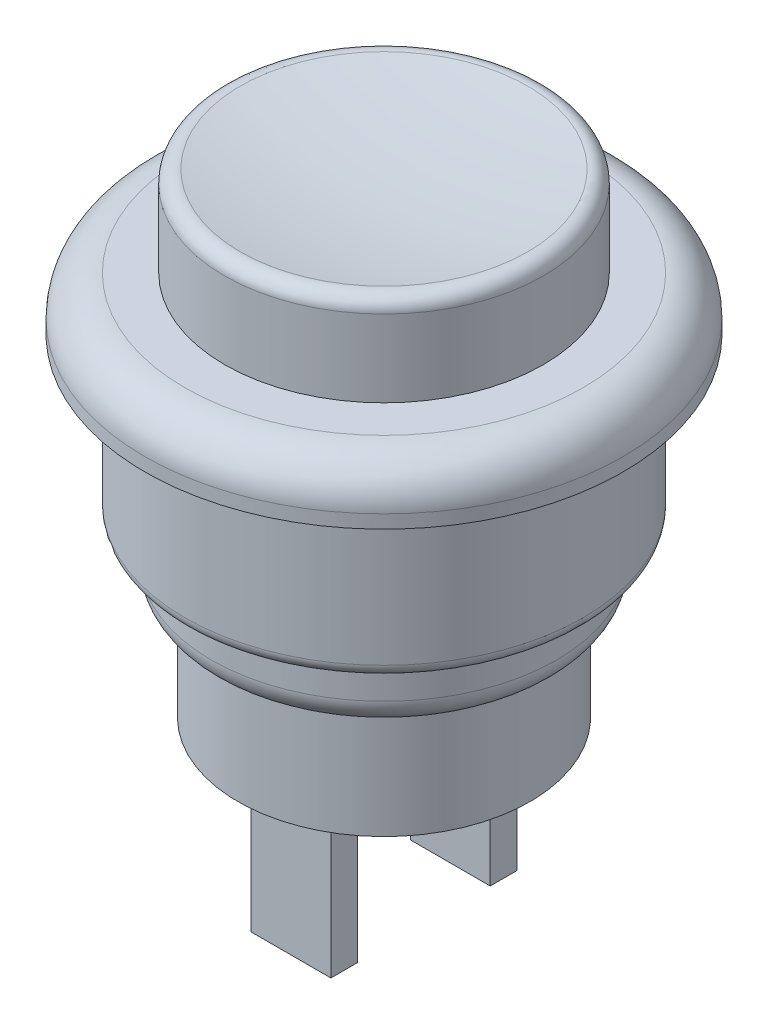
ISO-10303-21;
HEADER;
FILE_DESCRIPTION(('STEP AP214'),'2;1');
FILE_NAME('part.step','',(''),(''),'','','');
FILE_SCHEMA(('AUTOMOTIVE_DESIGN { 1 0 10303 214 1 1 1 1 }'));
ENDSEC;
DATA;
#1=APPLICATION_CONTEXT('core data for automotive mechanical design processes');
#2=APPLICATION_PROTOCOL_DEFINITION('international standard','automotive_design',2000,#1);
#3=PRODUCT_CONTEXT('',#1,'mechanical');
#4=PRODUCT('Part','Part','',(#3));
#5=PRODUCT_RELATED_PRODUCT_CATEGORY('part','',(#4));
#6=PRODUCT_DEFINITION_FORMATION('','',#4);
#7=PRODUCT_DEFINITION_CONTEXT('part definition',#1,'design');
#8=PRODUCT_DEFINITION('design','',#6,#7);
#9=PRODUCT_DEFINITION_SHAPE('','',#8);
#10=(LENGTH_UNIT() NAMED_UNIT(*) SI_UNIT(.MILLI.,.METRE.));
#11=(NAMED_UNIT(*) PLANE_ANGLE_UNIT() SI_UNIT($,.RADIAN.));
#12=(NAMED_UNIT(*) SI_UNIT($,.STERADIAN.) SOLID_ANGLE_UNIT());
#13=UNCERTAINTY_MEASURE_WITH_UNIT(LENGTH_MEASURE(1.E-05),#10,'distance_accuracy_value','');
#14=(GEOMETRIC_REPRESENTATION_CONTEXT(3) GLOBAL_UNCERTAINTY_ASSIGNED_CONTEXT((#13)) GLOBAL_UNIT_ASSIGNED_CONTEXT((#10,
#11,#12)) REPRESENTATION_CONTEXT('',''));
#15=CARTESIAN_POINT('',(0.,0.,0.));
#16=DIRECTION('',(0.,0.,1.));
#17=DIRECTION('',(1.,0.,0.));
#18=AXIS2_PLACEMENT_3D('',#15,#16,#17);
#19=CARTESIAN_POINT('',(5.5,-9.,0.));
#20=DIRECTION('',(0.,-1.,0.));
#21=DIRECTION('',(0.,0.,-1.));
#22=AXIS2_PLACEMENT_3D('',#19,#20,#21);
#23=PLANE('',#22);
#24=CARTESIAN_POINT('',(0.,-9.,0.));
#25=DIRECTION('',(0.,-1.,0.));
#26=DIRECTION('',(0.,0.,-1.));
#27=AXIS2_PLACEMENT_3D('',#24,#25,#26);
#28=CIRCLE('',#27,5.5);
#29=CARTESIAN_POINT('',(0.,-9.,-5.5));
#30=VERTEX_POINT('',#29);
#31=EDGE_CURVE('E171',#30,#30,#28,.T.);
#32=ORIENTED_EDGE('',*,*,#31,.T.);
#33=EDGE_LOOP('',(#32));
#34=FACE_BOUND('',#33,.T.);
#35=DIRECTION('',(1.,0.,0.));
#36=VECTOR('',#35,1.);
#37=CARTESIAN_POINT('',(-1.5,-9.,2.5));
#38=LINE('',#37,#36);
#39=CARTESIAN_POINT('',(-1.5,-9.,2.5));
#40=VERTEX_POINT('',#39);
#41=CARTESIAN_POINT('',(1.5,-9.,2.5));
#42=VERTEX_POINT('',#41);
#43=EDGE_CURVE('E128',#40,#42,#38,.T.);
#44=ORIENTED_EDGE('',*,*,#43,.F.);
#45=DIRECTION('',(0.,0.,-1.));
#46=VECTOR('',#45,1.);
#47=CARTESIAN_POINT('',(-1.5,-9.,3.5));
#48=LINE('',#47,#46);
#49=CARTESIAN_POINT('',(-1.5,-9.,3.5));
#50=VERTEX_POINT('',#49);
#51=EDGE_CURVE('E125',#50,#40,#48,.T.);
#52=ORIENTED_EDGE('',*,*,#51,.F.);
#53=DIRECTION('',(-1.,0.,0.));
#54=VECTOR('',#53,1.);
#55=CARTESIAN_POINT('',(-1.5,-9.,3.5));
#56=LINE('',#55,#54);
#57=CARTESIAN_POINT('',(1.5,-9.,3.5));
#58=VERTEX_POINT('',#57);
#59=EDGE_CURVE('E137',#58,#50,#56,.T.);
#60=ORIENTED_EDGE('',*,*,#59,.F.);
#61=DIRECTION('',(0.,0.,1.));
#62=VECTOR('',#61,1.);
#63=CARTESIAN_POINT('',(1.5,-9.,3.5));
#64=LINE('',#63,#62);
#65=EDGE_CURVE('E145',#42,#58,#64,.T.);
#66=ORIENTED_EDGE('',*,*,#65,.F.);
#67=EDGE_LOOP('',(#44,#52,#60,#66));
#68=FACE_BOUND('',#67,.T.);
#69=DIRECTION('',(1.,0.,0.));
#70=VECTOR('',#69,1.);
#71=CARTESIAN_POINT('',(-1.5,-9.,-3.5));
#72=LINE('',#71,#70);
#73=CARTESIAN_POINT('',(-1.5,-9.,-3.5));
#74=VERTEX_POINT('',#73);
#75=CARTESIAN_POINT('',(1.5,-9.,-3.5));
#76=VERTEX_POINT('',#75);
#77=EDGE_CURVE('E494',#74,#76,#72,.T.);
#78=ORIENTED_EDGE('',*,*,#77,.F.);
#79=DIRECTION('',(0.,0.,-1.));
#80=VECTOR('',#79,1.);
#81=CARTESIAN_POINT('',(-1.5,-9.,-3.5));
#82=LINE('',#81,#80);
#83=CARTESIAN_POINT('',(-1.5,-9.,-2.5));
#84=VERTEX_POINT('',#83);
#85=EDGE_CURVE('E123',#84,#74,#82,.T.);
#86=ORIENTED_EDGE('',*,*,#85,.F.);
#87=DIRECTION('',(-1.,0.,0.));
#88=VECTOR('',#87,1.);
#89=CARTESIAN_POINT('',(-1.5,-9.,-2.5));
#90=LINE('',#89,#88);
#91=CARTESIAN_POINT('',(1.5,-9.,-2.5));
#92=VERTEX_POINT('',#91);
#93=EDGE_CURVE('E119',#92,#84,#90,.T.);
#94=ORIENTED_EDGE('',*,*,#93,.F.);
#95=DIRECTION('',(0.,0.,1.));
#96=VECTOR('',#95,1.);
#97=CARTESIAN_POINT('',(1.5,-9.,-3.5));
#98=LINE('',#97,#96);
#99=EDGE_CURVE('E491',#76,#92,#98,.T.);
#100=ORIENTED_EDGE('',*,*,#99,.F.);
#101=EDGE_LOOP('',(#78,#86,#94,#100));
#102=FACE_BOUND('',#101,.T.);
#103=ADVANCED_FACE('F34',(#34,#68,#102),#23,.T.);
#104=CARTESIAN_POINT('',(0.,-9.,0.));
#105=DIRECTION('',(0.,-1.,0.));
#106=DIRECTION('',(0.,0.,-1.));
#107=AXIS2_PLACEMENT_3D('',#104,#105,#106);
#108=CYLINDRICAL_SURFACE('',#107,5.5);
#109=CARTESIAN_POINT('',(0.,-5.,0.));
#110=DIRECTION('',(0.,-1.,0.));
#111=DIRECTION('',(0.,0.,-1.));
#112=AXIS2_PLACEMENT_3D('',#109,#110,#111);
#113=CIRCLE('',#112,5.5);
#114=CARTESIAN_POINT('',(0.,-5.,-5.5));
#115=VERTEX_POINT('',#114);
#116=EDGE_CURVE('E168',#115,#115,#113,.T.);
#117=ORIENTED_EDGE('',*,*,#116,.T.);
#118=EDGE_LOOP('',(#117));
#119=FACE_BOUND('',#118,.T.);
#120=ORIENTED_EDGE('',*,*,#31,.F.);
#121=EDGE_LOOP('',(#120));
#122=FACE_BOUND('',#121,.T.);
#123=ADVANCED_FACE('F212',(#119,#122),#108,.T.);
#124=CARTESIAN_POINT('',(0.,-5.,0.));
#125=DIRECTION('',(0.,1.,0.));
#126=DIRECTION('',(0.,0.,1.));
#127=AXIS2_PLACEMENT_3D('',#124,#125,#126);
#128=CONICAL_SURFACE('',#127,5.5,1.10714871779409);
#129=CARTESIAN_POINT('',(0.,-4.77639320225002,0.));
#130=DIRECTION('',(0.,-1.,0.));
#131=DIRECTION('',(0.,0.,-1.));
#132=AXIS2_PLACEMENT_3D('',#129,#130,#131);
#133=CIRCLE('',#132,5.94721359549995);
#134=CARTESIAN_POINT('',(0.,-4.77639320225002,-5.94721359549995));
#135=VERTEX_POINT('',#134);
#136=EDGE_CURVE('E186',#135,#135,#133,.T.);
#137=ORIENTED_EDGE('',*,*,#136,.T.);
#138=EDGE_LOOP('',(#137));
#139=FACE_BOUND('',#138,.T.);
#140=ORIENTED_EDGE('',*,*,#116,.F.);
#141=EDGE_LOOP('',(#140));
#142=FACE_BOUND('',#141,.T.);
#143=ADVANCED_FACE('F218',(#139,#142),#128,.T.);
#144=CARTESIAN_POINT('',(0.,-9.,0.));
#145=DIRECTION('',(0.,-1.,0.));
#146=DIRECTION('',(0.,0.,-1.));
#147=AXIS2_PLACEMENT_3D('',#144,#145,#146);
#148=CYLINDRICAL_SURFACE('',#147,6.5);
#149=CARTESIAN_POINT('',(0.,-3.8819660112501,0.));
#150=DIRECTION('',(0.,1.,0.));
#151=DIRECTION('',(0.,0.,1.));
#152=AXIS2_PLACEMENT_3D('',#149,#150,#151);
#153=CIRCLE('',#152,6.5);
#154=CARTESIAN_POINT('',(0.,-3.8819660112501,6.5));
#155=VERTEX_POINT('',#154);
#156=EDGE_CURVE('E189',#155,#155,#153,.T.);
#157=ORIENTED_EDGE('',*,*,#156,.T.);
#158=EDGE_LOOP('',(#157));
#159=FACE_BOUND('',#158,.T.);
#160=CARTESIAN_POINT('',(0.,-2.5,0.));
#161=DIRECTION('',(0.,-1.,0.));
#162=DIRECTION('',(0.,0.,-1.));
#163=AXIS2_PLACEMENT_3D('',#160,#161,#162);
#164=CIRCLE('',#163,6.5);
#165=CARTESIAN_POINT('',(0.,-2.5,-6.5));
#166=VERTEX_POINT('',#165);
#167=EDGE_CURVE('E165',#166,#166,#164,.T.);
#168=ORIENTED_EDGE('',*,*,#167,.T.);
#169=EDGE_LOOP('',(#168));
#170=FACE_BOUND('',#169,.T.);
#171=ADVANCED_FACE('F265',(#159,#170),#148,.T.);
#172=CARTESIAN_POINT('',(7.5,-2.5,0.));
#173=DIRECTION('',(0.,-1.,0.));
#174=DIRECTION('',(0.,0.,-1.));
#175=AXIS2_PLACEMENT_3D('',#172,#173,#174);
#176=PLANE('',#175);
#177=CARTESIAN_POINT('',(0.,-2.5,0.));
#178=DIRECTION('',(0.,-1.,0.));
#179=DIRECTION('',(0.,0.,-1.));
#180=AXIS2_PLACEMENT_3D('',#177,#178,#179);
#181=CIRCLE('',#180,7.);
#182=CARTESIAN_POINT('',(0.,-2.5,-7.));
#183=VERTEX_POINT('',#182);
#184=EDGE_CURVE('E42',#183,#183,#181,.T.);
#185=ORIENTED_EDGE('',*,*,#184,.T.);
#186=EDGE_LOOP('',(#185));
#187=FACE_BOUND('',#186,.T.);
#188=ORIENTED_EDGE('',*,*,#167,.F.);
#189=EDGE_LOOP('',(#188));
#190=FACE_BOUND('',#189,.T.);
#191=ADVANCED_FACE('F194',(#187,#190),#176,.T.);
#192=CARTESIAN_POINT('',(0.,-9.,0.));
#193=DIRECTION('',(0.,-1.,0.));
#194=DIRECTION('',(0.,0.,-1.));
#195=AXIS2_PLACEMENT_3D('',#192,#193,#194);
#196=CYLINDRICAL_SURFACE('',#195,7.5);
#197=CARTESIAN_POINT('',(0.,-2.,0.));
#198=DIRECTION('',(0.,-1.,0.));
#199=DIRECTION('',(0.,0.,-1.));
#200=AXIS2_PLACEMENT_3D('',#197,#198,#199);
#201=CIRCLE('',#200,7.5);
#202=CARTESIAN_POINT('',(0.,-2.,-7.5));
#203=VERTEX_POINT('',#202);
#204=EDGE_CURVE('E11',#203,#203,#201,.F.);
#205=ORIENTED_EDGE('',*,*,#204,.T.);
#206=EDGE_LOOP('',(#205));
#207=FACE_BOUND('',#206,.T.);
#208=CARTESIAN_POINT('',(0.,3.5,0.));
#209=DIRECTION('',(0.,-1.,0.));
#210=DIRECTION('',(0.,0.,-1.));
#211=AXIS2_PLACEMENT_3D('',#208,#209,#210);
#212=CIRCLE('',#211,7.5);
#213=CARTESIAN_POINT('',(0.,3.5,-7.5));
#214=VERTEX_POINT('',#213);
#215=EDGE_CURVE('E162',#214,#214,#212,.T.);
#216=ORIENTED_EDGE('',*,*,#215,.T.);
#217=EDGE_LOOP('',(#216));
#218=FACE_BOUND('',#217,.T.);
#219=ADVANCED_FACE('F258',(#207,#218),#196,.T.);
#220=CARTESIAN_POINT('',(9.,3.5,0.));
#221=DIRECTION('',(0.,-1.,0.));
#222=DIRECTION('',(0.,0.,-1.));
#223=AXIS2_PLACEMENT_3D('',#220,#221,#222);
#224=PLANE('',#223);
#225=CARTESIAN_POINT('',(0.,3.5,0.));
#226=DIRECTION('',(0.,-1.,0.));
#227=DIRECTION('',(0.,0.,-1.));
#228=AXIS2_PLACEMENT_3D('',#225,#226,#227);
#229=CIRCLE('',#228,9.);
#230=CARTESIAN_POINT('',(0.,3.5,-9.));
#231=VERTEX_POINT('',#230);
#232=EDGE_CURVE('E159',#231,#231,#229,.T.);
#233=ORIENTED_EDGE('',*,*,#232,.T.);
#234=EDGE_LOOP('',(#233));
#235=FACE_BOUND('',#234,.T.);
#236=ORIENTED_EDGE('',*,*,#215,.F.);
#237=EDGE_LOOP('',(#236));
#238=FACE_BOUND('',#237,.T.);
#239=ADVANCED_FACE('F251',(#235,#238),#224,.T.);
#240=CARTESIAN_POINT('',(0.,-9.,0.));
#241=DIRECTION('',(0.,-1.,0.));
#242=DIRECTION('',(0.,0.,-1.));
#243=AXIS2_PLACEMENT_3D('',#240,#241,#242);
#244=CYLINDRICAL_SURFACE('',#243,9.);
#245=CARTESIAN_POINT('',(0.,4.,0.));
#246=DIRECTION('',(0.,1.,0.));
#247=DIRECTION('',(0.,0.,1.));
#248=AXIS2_PLACEMENT_3D('',#245,#246,#247);
#249=CIRCLE('',#248,9.);
#250=CARTESIAN_POINT('',(0.,4.,9.));
#251=VERTEX_POINT('',#250);
#252=EDGE_CURVE('E174',#251,#251,#249,.F.);
#253=ORIENTED_EDGE('',*,*,#252,.T.);
#254=EDGE_LOOP('',(#253));
#255=FACE_BOUND('',#254,.T.);
#256=ORIENTED_EDGE('',*,*,#232,.F.);
#257=EDGE_LOOP('',(#256));
#258=FACE_BOUND('',#257,.T.);
#259=ADVANCED_FACE('F245',(#255,#258),#244,.T.);
#260=CARTESIAN_POINT('',(6.,5.5,0.));
#261=DIRECTION('',(0.,1.,0.));
#262=DIRECTION('',(0.,0.,1.));
#263=AXIS2_PLACEMENT_3D('',#260,#261,#262);
#264=PLANE('',#263);
#265=CARTESIAN_POINT('',(0.,5.5,0.));
#266=DIRECTION('',(0.,1.,0.));
#267=DIRECTION('',(0.,0.,1.));
#268=AXIS2_PLACEMENT_3D('',#265,#266,#267);
#269=CIRCLE('',#268,7.5);
#270=CARTESIAN_POINT('',(0.,5.5,7.5));
#271=VERTEX_POINT('',#270);
#272=EDGE_CURVE('E177',#271,#271,#269,.T.);
#273=ORIENTED_EDGE('',*,*,#272,.T.);
#274=EDGE_LOOP('',(#273));
#275=FACE_BOUND('',#274,.T.);
#276=CARTESIAN_POINT('',(0.,5.5,0.));
#277=DIRECTION('',(0.,-1.,0.));
#278=DIRECTION('',(0.,0.,-1.));
#279=AXIS2_PLACEMENT_3D('',#276,#277,#278);
#280=CIRCLE('',#279,6.);
#281=CARTESIAN_POINT('',(0.,5.5,-6.));
#282=VERTEX_POINT('',#281);
#283=EDGE_CURVE('E156',#282,#282,#280,.T.);
#284=ORIENTED_EDGE('',*,*,#283,.T.);
#285=EDGE_LOOP('',(#284));
#286=FACE_BOUND('',#285,.T.);
#287=ADVANCED_FACE('F240',(#275,#286),#264,.T.);
#288=CARTESIAN_POINT('',(0.,-9.,0.));
#289=DIRECTION('',(0.,-1.,0.));
#290=DIRECTION('',(0.,0.,-1.));
#291=AXIS2_PLACEMENT_3D('',#288,#289,#290);
#292=CYLINDRICAL_SURFACE('',#291,6.);
#293=CARTESIAN_POINT('',(0.,8.39430237914633,0.));
#294=DIRECTION('',(0.,1.,0.));
#295=DIRECTION('',(0.,0.,1.));
#296=AXIS2_PLACEMENT_3D('',#293,#294,#295);
#297=CIRCLE('',#296,6.);
#298=CARTESIAN_POINT('',(0.,8.39430237914633,6.));
#299=VERTEX_POINT('',#298);
#300=EDGE_CURVE('E180',#299,#299,#297,.F.);
#301=ORIENTED_EDGE('',*,*,#300,.T.);
#302=EDGE_LOOP('',(#301));
#303=FACE_BOUND('',#302,.T.);
#304=ORIENTED_EDGE('',*,*,#283,.F.);
#305=EDGE_LOOP('',(#304));
#306=FACE_BOUND('',#305,.T.);
#307=ADVANCED_FACE('F237',(#303,#306),#292,.T.);
#308=CARTESIAN_POINT('',(0.,38.5041355995166,0.));
#309=DIRECTION('',(0.,-1.,0.));
#310=DIRECTION('',(1.,0.,0.));
#311=AXIS2_PLACEMENT_3D('',#308,#309,#310);
#312=SPHERICAL_SURFACE('',#311,30.1080390838504);
#313=CARTESIAN_POINT('',(0.,8.88616389856423,0.));
#314=DIRECTION('',(0.,1.,0.));
#315=DIRECTION('',(0.,0.,1.));
#316=AXIS2_PLACEMENT_3D('',#313,#314,#315);
#317=CIRCLE('',#316,5.41015432277558);
#318=CARTESIAN_POINT('',(0.,8.88616389856423,5.41015432277558));
#319=VERTEX_POINT('',#318);
#320=EDGE_CURVE('E183',#319,#319,#317,.T.);
#321=ORIENTED_EDGE('',*,*,#320,.T.);
#322=EDGE_LOOP('',(#321));
#323=FACE_BOUND('',#322,.T.);
#324=ADVANCED_FACE('F227',(#323),#312,.F.);
#325=CARTESIAN_POINT('',(0.,4.,0.));
#326=DIRECTION('',(0.,1.,0.));
#327=DIRECTION('',(0.,0.,1.));
#328=AXIS2_PLACEMENT_3D('',#325,#326,#327);
#329=TOROIDAL_SURFACE('',#328,7.5,1.5);
#330=ORIENTED_EDGE('',*,*,#272,.F.);
#331=EDGE_LOOP('',(#330));
#332=FACE_BOUND('',#331,.T.);
#333=ORIENTED_EDGE('',*,*,#252,.F.);
#334=EDGE_LOOP('',(#333));
#335=FACE_BOUND('',#334,.T.);
#336=ADVANCED_FACE('F224',(#332,#335),#329,.T.);
#337=CARTESIAN_POINT('',(0.,8.39430237914633,0.));
#338=DIRECTION('',(0.,1.,0.));
#339=DIRECTION('',(0.,0.,1.));
#340=AXIS2_PLACEMENT_3D('',#337,#338,#339);
#341=TOROIDAL_SURFACE('',#340,5.5,0.5);
#342=ORIENTED_EDGE('',*,*,#320,.F.);
#343=EDGE_LOOP('',(#342));
#344=FACE_BOUND('',#343,.T.);
#345=ORIENTED_EDGE('',*,*,#300,.F.);
#346=EDGE_LOOP('',(#345));
#347=FACE_BOUND('',#346,.T.);
#348=ADVANCED_FACE('F208',(#344,#347),#341,.T.);
#349=CARTESIAN_POINT('',(0.,-3.8819660112501,0.));
#350=DIRECTION('',(0.,1.,0.));
#351=DIRECTION('',(0.,0.,1.));
#352=AXIS2_PLACEMENT_3D('',#349,#350,#351);
#353=TOROIDAL_SURFACE('',#352,5.5,1.);
#354=ORIENTED_EDGE('',*,*,#156,.F.);
#355=EDGE_LOOP('',(#354));
#356=FACE_BOUND('',#355,.T.);
#357=ORIENTED_EDGE('',*,*,#136,.F.);
#358=EDGE_LOOP('',(#357));
#359=FACE_BOUND('',#358,.T.);
#360=ADVANCED_FACE('F199',(#356,#359),#353,.T.);
#361=CARTESIAN_POINT('',(0.,-2.,0.));
#362=DIRECTION('',(0.,-1.,0.));
#363=DIRECTION('',(0.,0.,-1.));
#364=AXIS2_PLACEMENT_3D('',#361,#362,#363);
#365=TOROIDAL_SURFACE('',#364,7.,0.5);
#366=ORIENTED_EDGE('',*,*,#204,.F.);
#367=EDGE_LOOP('',(#366));
#368=FACE_BOUND('',#367,.T.);
#369=ORIENTED_EDGE('',*,*,#184,.F.);
#370=EDGE_LOOP('',(#369));
#371=FACE_BOUND('',#370,.T.);
#372=ADVANCED_FACE('F36',(#368,#371),#365,.T.);
#373=CARTESIAN_POINT('',(-1.5,-15.,3.5));
#374=DIRECTION('',(1.,0.,0.));
#375=DIRECTION('',(0.,0.,-1.));
#376=AXIS2_PLACEMENT_3D('',#373,#374,#375);
#377=PLANE('',#376);
#378=ORIENTED_EDGE('',*,*,#51,.T.);
#379=DIRECTION('',(0.,1.,0.));
#380=VECTOR('',#379,1.);
#381=CARTESIAN_POINT('',(-1.5,-15.,2.5));
#382=LINE('',#381,#380);
#383=CARTESIAN_POINT('',(-1.5,-15.,2.5));
#384=VERTEX_POINT('',#383);
#385=EDGE_CURVE('E154',#384,#40,#382,.T.);
#386=ORIENTED_EDGE('',*,*,#385,.F.);
#387=DIRECTION('',(0.,0.,-1.));
#388=VECTOR('',#387,1.);
#389=CARTESIAN_POINT('',(-1.5,-15.,3.5));
#390=LINE('',#389,#388);
#391=CARTESIAN_POINT('',(-1.5,-15.,3.5));
#392=VERTEX_POINT('',#391);
#393=EDGE_CURVE('E133',#392,#384,#390,.T.);
#394=ORIENTED_EDGE('',*,*,#393,.F.);
#395=DIRECTION('',(0.,1.,0.));
#396=VECTOR('',#395,1.);
#397=CARTESIAN_POINT('',(-1.5,-15.,3.5));
#398=LINE('',#397,#396);
#399=EDGE_CURVE('E142',#392,#50,#398,.T.);
#400=ORIENTED_EDGE('',*,*,#399,.T.);
#401=EDGE_LOOP('',(#378,#386,#394,#400));
#402=FACE_BOUND('',#401,.T.);
#403=ADVANCED_FACE('F198',(#402),#377,.F.);
#404=CARTESIAN_POINT('',(-1.5,-15.,2.5));
#405=DIRECTION('',(0.,0.,1.));
#406=DIRECTION('',(1.,0.,0.));
#407=AXIS2_PLACEMENT_3D('',#404,#405,#406);
#408=PLANE('',#407);
#409=ORIENTED_EDGE('',*,*,#43,.T.);
#410=DIRECTION('',(0.,1.,0.));
#411=VECTOR('',#410,1.);
#412=CARTESIAN_POINT('',(1.5,-15.,2.5));
#413=LINE('',#412,#411);
#414=CARTESIAN_POINT('',(1.5,-15.,2.5));
#415=VERTEX_POINT('',#414);
#416=EDGE_CURVE('E151',#415,#42,#413,.T.);
#417=ORIENTED_EDGE('',*,*,#416,.F.);
#418=DIRECTION('',(1.,0.,0.));
#419=VECTOR('',#418,1.);
#420=CARTESIAN_POINT('',(-1.5,-15.,2.5));
#421=LINE('',#420,#419);
#422=EDGE_CURVE('E136',#384,#415,#421,.T.);
#423=ORIENTED_EDGE('',*,*,#422,.F.);
#424=ORIENTED_EDGE('',*,*,#385,.T.);
#425=EDGE_LOOP('',(#409,#417,#423,#424));
#426=FACE_BOUND('',#425,.T.);
#427=ADVANCED_FACE('F205',(#426),#408,.F.);
#428=CARTESIAN_POINT('',(1.5,-15.,3.5));
#429=DIRECTION('',(-1.,0.,0.));
#430=DIRECTION('',(0.,0.,1.));
#431=AXIS2_PLACEMENT_3D('',#428,#429,#430);
#432=PLANE('',#431);
#433=ORIENTED_EDGE('',*,*,#65,.T.);
#434=DIRECTION('',(0.,1.,0.));
#435=VECTOR('',#434,1.);
#436=CARTESIAN_POINT('',(1.5,-15.,3.5));
#437=LINE('',#436,#435);
#438=CARTESIAN_POINT('',(1.5,-15.,3.5));
#439=VERTEX_POINT('',#438);
#440=EDGE_CURVE('E57',#439,#58,#437,.T.);
#441=ORIENTED_EDGE('',*,*,#440,.F.);
#442=DIRECTION('',(0.,0.,1.));
#443=VECTOR('',#442,1.);
#444=CARTESIAN_POINT('',(1.5,-15.,3.5));
#445=LINE('',#444,#443);
#446=EDGE_CURVE('E139',#415,#439,#445,.T.);
#447=ORIENTED_EDGE('',*,*,#446,.F.);
#448=ORIENTED_EDGE('',*,*,#416,.T.);
#449=EDGE_LOOP('',(#433,#441,#447,#448));
#450=FACE_BOUND('',#449,.T.);
#451=ADVANCED_FACE('F394',(#450),#432,.F.);
#452=CARTESIAN_POINT('',(-1.5,-15.,3.5));
#453=DIRECTION('',(0.,0.,-1.));
#454=DIRECTION('',(-1.,0.,0.));
#455=AXIS2_PLACEMENT_3D('',#452,#453,#454);
#456=PLANE('',#455);
#457=ORIENTED_EDGE('',*,*,#59,.T.);
#458=ORIENTED_EDGE('',*,*,#399,.F.);
#459=DIRECTION('',(-1.,0.,0.));
#460=VECTOR('',#459,1.);
#461=CARTESIAN_POINT('',(-1.5,-15.,3.5));
#462=LINE('',#461,#460);
#463=EDGE_CURVE('E141',#439,#392,#462,.T.);
#464=ORIENTED_EDGE('',*,*,#463,.F.);
#465=ORIENTED_EDGE('',*,*,#440,.T.);
#466=EDGE_LOOP('',(#457,#458,#464,#465));
#467=FACE_BOUND('',#466,.T.);
#468=ADVANCED_FACE('F405',(#467),#456,.F.);
#469=CARTESIAN_POINT('',(0.,-15.,0.));
#470=DIRECTION('',(0.,-1.,0.));
#471=DIRECTION('',(0.,0.,-1.));
#472=AXIS2_PLACEMENT_3D('',#469,#470,#471);
#473=PLANE('',#472);
#474=ORIENTED_EDGE('',*,*,#393,.T.);
#475=ORIENTED_EDGE('',*,*,#422,.T.);
#476=ORIENTED_EDGE('',*,*,#446,.T.);
#477=ORIENTED_EDGE('',*,*,#463,.T.);
#478=EDGE_LOOP('',(#474,#475,#476,#477));
#479=FACE_BOUND('',#478,.T.);
#480=ADVANCED_FACE('F416',(#479),#473,.T.);
#481=CARTESIAN_POINT('',(-1.5,-15.,-3.5));
#482=DIRECTION('',(1.,0.,0.));
#483=DIRECTION('',(0.,0.,-1.));
#484=AXIS2_PLACEMENT_3D('',#481,#482,#483);
#485=PLANE('',#484);
#486=ORIENTED_EDGE('',*,*,#85,.T.);
#487=DIRECTION('',(0.,1.,0.));
#488=VECTOR('',#487,1.);
#489=CARTESIAN_POINT('',(-1.5,-15.,-3.5));
#490=LINE('',#489,#488);
#491=CARTESIAN_POINT('',(-1.5,-15.,-3.5));
#492=VERTEX_POINT('',#491);
#493=EDGE_CURVE('E104',#492,#74,#490,.T.);
#494=ORIENTED_EDGE('',*,*,#493,.F.);
#495=DIRECTION('',(0.,0.,-1.));
#496=VECTOR('',#495,1.);
#497=CARTESIAN_POINT('',(-1.5,-15.,-3.5));
#498=LINE('',#497,#496);
#499=CARTESIAN_POINT('',(-1.5,-15.,-2.5));
#500=VERTEX_POINT('',#499);
#501=EDGE_CURVE('E111',#500,#492,#498,.T.);
#502=ORIENTED_EDGE('',*,*,#501,.F.);
#503=DIRECTION('',(0.,1.,0.));
#504=VECTOR('',#503,1.);
#505=CARTESIAN_POINT('',(-1.5,-15.,-2.5));
#506=LINE('',#505,#504);
#507=EDGE_CURVE('E488',#500,#84,#506,.T.);
#508=ORIENTED_EDGE('',*,*,#507,.T.);
#509=EDGE_LOOP('',(#486,#494,#502,#508));
#510=FACE_BOUND('',#509,.T.);
#511=ADVANCED_FACE('F121',(#510),#485,.F.);
#512=CARTESIAN_POINT('',(-1.5,-15.,-3.5));
#513=DIRECTION('',(0.,0.,1.));
#514=DIRECTION('',(1.,0.,0.));
#515=AXIS2_PLACEMENT_3D('',#512,#513,#514);
#516=PLANE('',#515);
#517=ORIENTED_EDGE('',*,*,#77,.T.);
#518=DIRECTION('',(0.,1.,0.));
#519=VECTOR('',#518,1.);
#520=CARTESIAN_POINT('',(1.5,-15.,-3.5));
#521=LINE('',#520,#519);
#522=CARTESIAN_POINT('',(1.5,-15.,-3.5));
#523=VERTEX_POINT('',#522);
#524=EDGE_CURVE('E107',#523,#76,#521,.T.);
#525=ORIENTED_EDGE('',*,*,#524,.F.);
#526=DIRECTION('',(1.,0.,0.));
#527=VECTOR('',#526,1.);
#528=CARTESIAN_POINT('',(-1.5,-15.,-3.5));
#529=LINE('',#528,#527);
#530=EDGE_CURVE('E100',#492,#523,#529,.T.);
#531=ORIENTED_EDGE('',*,*,#530,.F.);
#532=ORIENTED_EDGE('',*,*,#493,.T.);
#533=EDGE_LOOP('',(#517,#525,#531,#532));
#534=FACE_BOUND('',#533,.T.);
#535=ADVANCED_FACE('F102',(#534),#516,.F.);
#536=CARTESIAN_POINT('',(1.5,-15.,-3.5));
#537=DIRECTION('',(-1.,0.,0.));
#538=DIRECTION('',(0.,0.,1.));
#539=AXIS2_PLACEMENT_3D('',#536,#537,#538);
#540=PLANE('',#539);
#541=ORIENTED_EDGE('',*,*,#99,.T.);
#542=DIRECTION('',(0.,1.,0.));
#543=VECTOR('',#542,1.);
#544=CARTESIAN_POINT('',(1.5,-15.,-2.5));
#545=LINE('',#544,#543);
#546=CARTESIAN_POINT('',(1.5,-15.,-2.5));
#547=VERTEX_POINT('',#546);
#548=EDGE_CURVE('E49',#547,#92,#545,.T.);
#549=ORIENTED_EDGE('',*,*,#548,.F.);
#550=DIRECTION('',(0.,0.,1.));
#551=VECTOR('',#550,1.);
#552=CARTESIAN_POINT('',(1.5,-15.,-3.5));
#553=LINE('',#552,#551);
#554=EDGE_CURVE('E110',#523,#547,#553,.T.);
#555=ORIENTED_EDGE('',*,*,#554,.F.);
#556=ORIENTED_EDGE('',*,*,#524,.T.);
#557=EDGE_LOOP('',(#541,#549,#555,#556));
#558=FACE_BOUND('',#557,.T.);
#559=ADVANCED_FACE('F447',(#558),#540,.F.);
#560=CARTESIAN_POINT('',(-1.5,-15.,-2.5));
#561=DIRECTION('',(0.,0.,-1.));
#562=DIRECTION('',(-1.,0.,0.));
#563=AXIS2_PLACEMENT_3D('',#560,#561,#562);
#564=PLANE('',#563);
#565=ORIENTED_EDGE('',*,*,#93,.T.);
#566=ORIENTED_EDGE('',*,*,#507,.F.);
#567=DIRECTION('',(-1.,0.,0.));
#568=VECTOR('',#567,1.);
#569=CARTESIAN_POINT('',(-1.5,-15.,-2.5));
#570=LINE('',#569,#568);
#571=EDGE_CURVE('E115',#547,#500,#570,.T.);
#572=ORIENTED_EDGE('',*,*,#571,.F.);
#573=ORIENTED_EDGE('',*,*,#548,.T.);
#574=EDGE_LOOP('',(#565,#566,#572,#573));
#575=FACE_BOUND('',#574,.T.);
#576=ADVANCED_FACE('F456',(#575),#564,.F.);
#577=CARTESIAN_POINT('',(0.,-15.,0.));
#578=DIRECTION('',(0.,1.,0.));
#579=DIRECTION('',(0.,0.,1.));
#580=AXIS2_PLACEMENT_3D('',#577,#578,#579);
#581=PLANE('',#580);
#582=ORIENTED_EDGE('',*,*,#501,.T.);
#583=ORIENTED_EDGE('',*,*,#530,.T.);
#584=ORIENTED_EDGE('',*,*,#554,.T.);
#585=ORIENTED_EDGE('',*,*,#571,.T.);
#586=EDGE_LOOP('',(#582,#583,#584,#585));
#587=FACE_BOUND('',#586,.T.);
#588=ADVANCED_FACE('F114',(#587),#581,.F.);
#589=CLOSED_SHELL('',(#103,#123,#143,#171,#191,#219,#239,#259,#287,#307,#324,#336,#348,#360,
#372,#403,#427,#451,#468,#480,#511,#535,#559,#576,#588));
#590=MANIFOLD_SOLID_BREP('B2',#589);
#591=ADVANCED_BREP_SHAPE_REPRESENTATION('',(#18,#590),#14);
#592=SHAPE_DEFINITION_REPRESENTATION(#9,#591);
ENDSEC;
END-ISO-10303-21;
